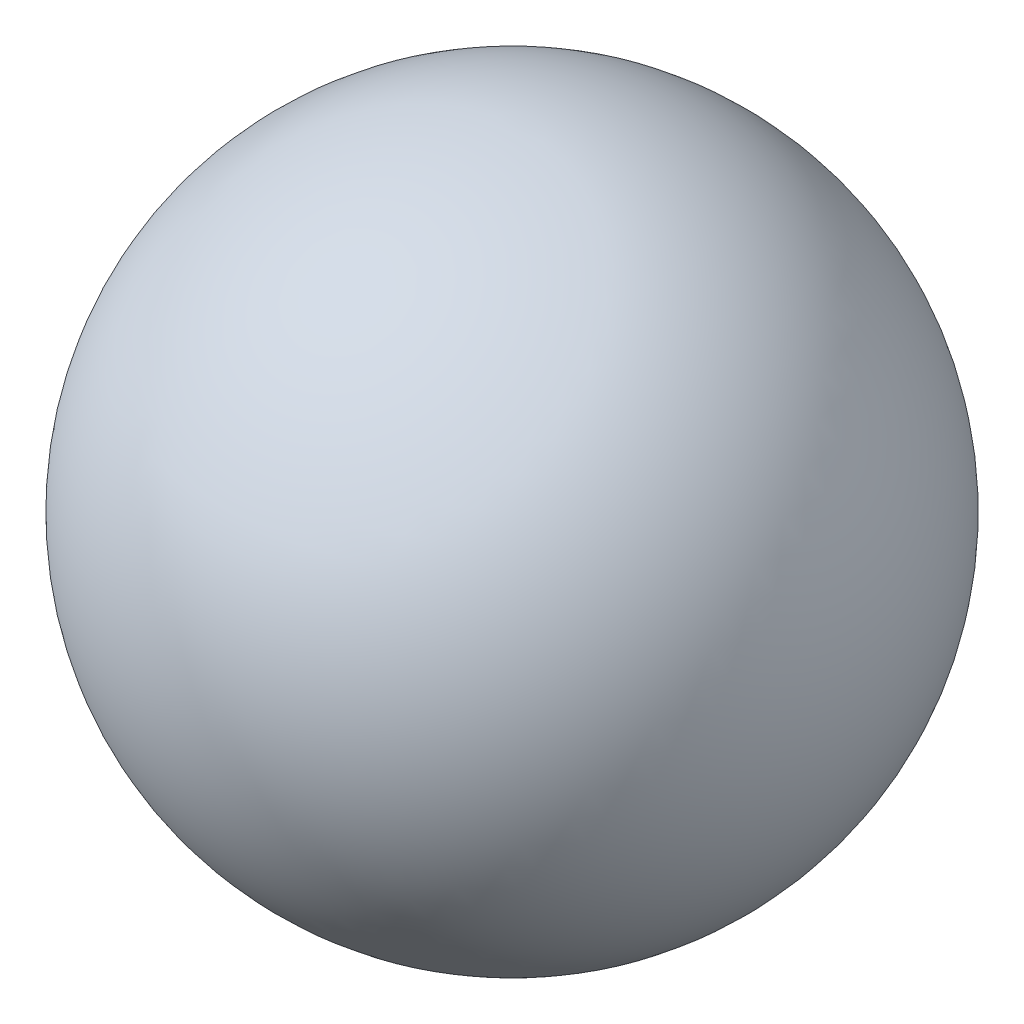
ISO-10303-21;
HEADER;
FILE_DESCRIPTION(('STEP AP214'),'2;1');
FILE_NAME('part.step','',(''),(''),'','','');
FILE_SCHEMA(('AUTOMOTIVE_DESIGN { 1 0 10303 214 1 1 1 1 }'));
ENDSEC;
DATA;
#1=APPLICATION_CONTEXT('core data for automotive mechanical design processes');
#2=APPLICATION_PROTOCOL_DEFINITION('international standard','automotive_design',2000,#1);
#3=PRODUCT_CONTEXT('',#1,'mechanical');
#4=PRODUCT('Part','Part','',(#3));
#5=PRODUCT_RELATED_PRODUCT_CATEGORY('part','',(#4));
#6=PRODUCT_DEFINITION_FORMATION('','',#4);
#7=PRODUCT_DEFINITION_CONTEXT('part definition',#1,'design');
#8=PRODUCT_DEFINITION('design','',#6,#7);
#9=PRODUCT_DEFINITION_SHAPE('','',#8);
#10=(LENGTH_UNIT() NAMED_UNIT(*) SI_UNIT(.MILLI.,.METRE.));
#11=(NAMED_UNIT(*) PLANE_ANGLE_UNIT() SI_UNIT($,.RADIAN.));
#12=(NAMED_UNIT(*) SI_UNIT($,.STERADIAN.) SOLID_ANGLE_UNIT());
#13=UNCERTAINTY_MEASURE_WITH_UNIT(LENGTH_MEASURE(1.E-05),#10,'distance_accuracy_value','');
#14=(GEOMETRIC_REPRESENTATION_CONTEXT(3) GLOBAL_UNCERTAINTY_ASSIGNED_CONTEXT((#13)) GLOBAL_UNIT_ASSIGNED_CONTEXT((#10,
#11,#12)) REPRESENTATION_CONTEXT('',''));
#15=CARTESIAN_POINT('',(0.,0.,0.));
#16=DIRECTION('',(0.,0.,1.));
#17=DIRECTION('',(1.,0.,0.));
#18=AXIS2_PLACEMENT_3D('',#15,#16,#17);
#19=CARTESIAN_POINT('',(0.,0.,0.));
#20=DIRECTION('',(0.,1.,0.));
#21=DIRECTION('',(1.,0.,0.));
#22=AXIS2_PLACEMENT_3D('',#19,#20,#21);
#23=SPHERICAL_SURFACE('',#22,11.303);
#24=CARTESIAN_POINT('',(0.,11.303,0.));
#25=VERTEX_POINT('',#24);
#26=VERTEX_LOOP('',#25);
#27=FACE_BOUND('',#26,.T.);
#28=ADVANCED_FACE('F33',(#27),#23,.T.);
#29=CLOSED_SHELL('',(#28));
#30=MANIFOLD_SOLID_BREP('B2',#29);
#31=ADVANCED_BREP_SHAPE_REPRESENTATION('',(#18,#30),#14);
#32=SHAPE_DEFINITION_REPRESENTATION(#9,#31);
ENDSEC;
END-ISO-10303-21;
